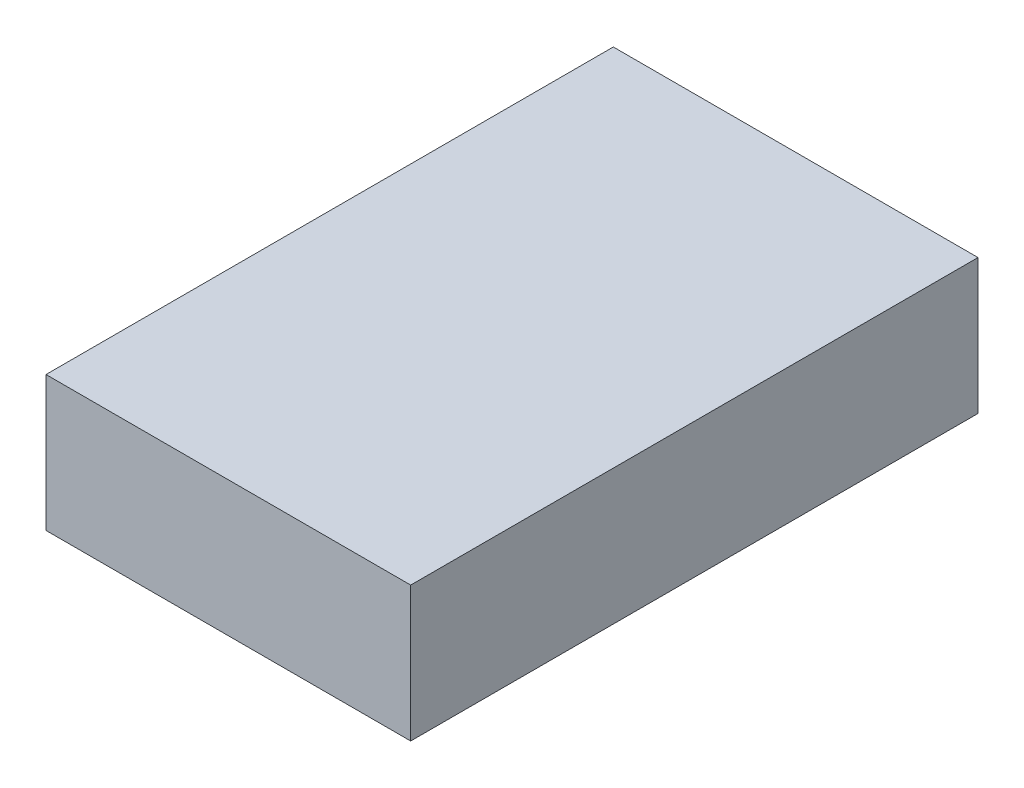
ISO-10303-21;
HEADER;
FILE_DESCRIPTION(('STEP AP214'),'2;1');
FILE_NAME('part.step','',(''),(''),'','','');
FILE_SCHEMA(('AUTOMOTIVE_DESIGN { 1 0 10303 214 1 1 1 1 }'));
ENDSEC;
DATA;
#1=APPLICATION_CONTEXT('core data for automotive mechanical design processes');
#2=APPLICATION_PROTOCOL_DEFINITION('international standard','automotive_design',2000,#1);
#3=PRODUCT_CONTEXT('',#1,'mechanical');
#4=PRODUCT('Part','Part','',(#3));
#5=PRODUCT_RELATED_PRODUCT_CATEGORY('part','',(#4));
#6=PRODUCT_DEFINITION_FORMATION('','',#4);
#7=PRODUCT_DEFINITION_CONTEXT('part definition',#1,'design');
#8=PRODUCT_DEFINITION('design','',#6,#7);
#9=PRODUCT_DEFINITION_SHAPE('','',#8);
#10=(LENGTH_UNIT() NAMED_UNIT(*) SI_UNIT(.MILLI.,.METRE.));
#11=(NAMED_UNIT(*) PLANE_ANGLE_UNIT() SI_UNIT($,.RADIAN.));
#12=(NAMED_UNIT(*) SI_UNIT($,.STERADIAN.) SOLID_ANGLE_UNIT());
#13=UNCERTAINTY_MEASURE_WITH_UNIT(LENGTH_MEASURE(1.E-05),#10,'distance_accuracy_value','');
#14=(GEOMETRIC_REPRESENTATION_CONTEXT(3) GLOBAL_UNCERTAINTY_ASSIGNED_CONTEXT((#13)) GLOBAL_UNIT_ASSIGNED_CONTEXT((#10,
#11,#12)) REPRESENTATION_CONTEXT('',''));
#15=CARTESIAN_POINT('',(0.,0.,0.));
#16=DIRECTION('',(0.,0.,1.));
#17=DIRECTION('',(1.,0.,0.));
#18=AXIS2_PLACEMENT_3D('',#15,#16,#17);
#19=CARTESIAN_POINT('',(67.5,-25.,210.));
#20=DIRECTION('',(-1.,0.,0.));
#21=DIRECTION('',(0.,0.,1.));
#22=AXIS2_PLACEMENT_3D('',#19,#20,#21);
#23=PLANE('',#22);
#24=DIRECTION('',(0.,1.,0.));
#25=VECTOR('',#24,1.);
#26=CARTESIAN_POINT('',(67.5,-25.,0.));
#27=LINE('',#26,#25);
#28=CARTESIAN_POINT('',(67.5,-25.,0.));
#29=VERTEX_POINT('',#28);
#30=CARTESIAN_POINT('',(67.5,25.,0.));
#31=VERTEX_POINT('',#30);
#32=EDGE_CURVE('E96',#29,#31,#27,.T.);
#33=ORIENTED_EDGE('',*,*,#32,.T.);
#34=DIRECTION('',(0.,0.,-1.));
#35=VECTOR('',#34,1.);
#36=CARTESIAN_POINT('',(67.5,25.,210.));
#37=LINE('',#36,#35);
#38=CARTESIAN_POINT('',(67.5,25.,210.));
#39=VERTEX_POINT('',#38);
#40=EDGE_CURVE('E11',#39,#31,#37,.T.);
#41=ORIENTED_EDGE('',*,*,#40,.F.);
#42=DIRECTION('',(0.,1.,0.));
#43=VECTOR('',#42,1.);
#44=CARTESIAN_POINT('',(67.5,-25.,210.));
#45=LINE('',#44,#43);
#46=CARTESIAN_POINT('',(67.5,-25.,210.));
#47=VERTEX_POINT('',#46);
#48=EDGE_CURVE('E84',#47,#39,#45,.T.);
#49=ORIENTED_EDGE('',*,*,#48,.F.);
#50=DIRECTION('',(0.,0.,-1.));
#51=VECTOR('',#50,1.);
#52=CARTESIAN_POINT('',(67.5,-25.,210.));
#53=LINE('',#52,#51);
#54=EDGE_CURVE('E92',#47,#29,#53,.T.);
#55=ORIENTED_EDGE('',*,*,#54,.T.);
#56=EDGE_LOOP('',(#33,#41,#49,#55));
#57=FACE_BOUND('',#56,.T.);
#58=ADVANCED_FACE('F33',(#57),#23,.F.);
#59=CARTESIAN_POINT('',(-67.5,25.,210.));
#60=DIRECTION('',(0.,-1.,0.));
#61=DIRECTION('',(0.,0.,-1.));
#62=AXIS2_PLACEMENT_3D('',#59,#60,#61);
#63=PLANE('',#62);
#64=DIRECTION('',(-1.,0.,0.));
#65=VECTOR('',#64,1.);
#66=CARTESIAN_POINT('',(-67.5,25.,0.));
#67=LINE('',#66,#65);
#68=CARTESIAN_POINT('',(-67.5,25.,0.));
#69=VERTEX_POINT('',#68);
#70=EDGE_CURVE('E88',#31,#69,#67,.T.);
#71=ORIENTED_EDGE('',*,*,#70,.T.);
#72=DIRECTION('',(0.,0.,-1.));
#73=VECTOR('',#72,1.);
#74=CARTESIAN_POINT('',(-67.5,25.,210.));
#75=LINE('',#74,#73);
#76=CARTESIAN_POINT('',(-67.5,25.,210.));
#77=VERTEX_POINT('',#76);
#78=EDGE_CURVE('E41',#77,#69,#75,.T.);
#79=ORIENTED_EDGE('',*,*,#78,.F.);
#80=DIRECTION('',(-1.,0.,0.));
#81=VECTOR('',#80,1.);
#82=CARTESIAN_POINT('',(-67.5,25.,210.));
#83=LINE('',#82,#81);
#84=EDGE_CURVE('E79',#39,#77,#83,.T.);
#85=ORIENTED_EDGE('',*,*,#84,.F.);
#86=ORIENTED_EDGE('',*,*,#40,.T.);
#87=EDGE_LOOP('',(#71,#79,#85,#86));
#88=FACE_BOUND('',#87,.T.);
#89=ADVANCED_FACE('F87',(#88),#63,.F.);
#90=CARTESIAN_POINT('',(-67.5,-25.,210.));
#91=DIRECTION('',(1.,0.,0.));
#92=DIRECTION('',(0.,0.,-1.));
#93=AXIS2_PLACEMENT_3D('',#90,#91,#92);
#94=PLANE('',#93);
#95=DIRECTION('',(0.,-1.,0.));
#96=VECTOR('',#95,1.);
#97=CARTESIAN_POINT('',(-67.5,-25.,0.));
#98=LINE('',#97,#96);
#99=CARTESIAN_POINT('',(-67.5,-25.,0.));
#100=VERTEX_POINT('',#99);
#101=EDGE_CURVE('E66',#69,#100,#98,.T.);
#102=ORIENTED_EDGE('',*,*,#101,.T.);
#103=DIRECTION('',(0.,0.,-1.));
#104=VECTOR('',#103,1.);
#105=CARTESIAN_POINT('',(-67.5,-25.,210.));
#106=LINE('',#105,#104);
#107=CARTESIAN_POINT('',(-67.5,-25.,210.));
#108=VERTEX_POINT('',#107);
#109=EDGE_CURVE('E89',#108,#100,#106,.T.);
#110=ORIENTED_EDGE('',*,*,#109,.F.);
#111=DIRECTION('',(0.,-1.,0.));
#112=VECTOR('',#111,1.);
#113=CARTESIAN_POINT('',(-67.5,-25.,210.));
#114=LINE('',#113,#112);
#115=EDGE_CURVE('E82',#77,#108,#114,.T.);
#116=ORIENTED_EDGE('',*,*,#115,.F.);
#117=ORIENTED_EDGE('',*,*,#78,.T.);
#118=EDGE_LOOP('',(#102,#110,#116,#117));
#119=FACE_BOUND('',#118,.T.);
#120=ADVANCED_FACE('F90',(#119),#94,.F.);
#121=CARTESIAN_POINT('',(-67.5,-25.,210.));
#122=DIRECTION('',(0.,1.,0.));
#123=DIRECTION('',(0.,0.,1.));
#124=AXIS2_PLACEMENT_3D('',#121,#122,#123);
#125=PLANE('',#124);
#126=DIRECTION('',(1.,0.,0.));
#127=VECTOR('',#126,1.);
#128=CARTESIAN_POINT('',(-67.5,-25.,0.));
#129=LINE('',#128,#127);
#130=EDGE_CURVE('E72',#100,#29,#129,.T.);
#131=ORIENTED_EDGE('',*,*,#130,.T.);
#132=ORIENTED_EDGE('',*,*,#54,.F.);
#133=DIRECTION('',(1.,0.,0.));
#134=VECTOR('',#133,1.);
#135=CARTESIAN_POINT('',(-67.5,-25.,210.));
#136=LINE('',#135,#134);
#137=EDGE_CURVE('E49',#108,#47,#136,.T.);
#138=ORIENTED_EDGE('',*,*,#137,.F.);
#139=ORIENTED_EDGE('',*,*,#109,.T.);
#140=EDGE_LOOP('',(#131,#132,#138,#139));
#141=FACE_BOUND('',#140,.T.);
#142=ADVANCED_FACE('F103',(#141),#125,.F.);
#143=CARTESIAN_POINT('',(0.,0.,210.));
#144=DIRECTION('',(0.,0.,-1.));
#145=DIRECTION('',(-1.,0.,0.));
#146=AXIS2_PLACEMENT_3D('',#143,#144,#145);
#147=PLANE('',#146);
#148=ORIENTED_EDGE('',*,*,#48,.T.);
#149=ORIENTED_EDGE('',*,*,#84,.T.);
#150=ORIENTED_EDGE('',*,*,#115,.T.);
#151=ORIENTED_EDGE('',*,*,#137,.T.);
#152=EDGE_LOOP('',(#148,#149,#150,#151));
#153=FACE_BOUND('',#152,.T.);
#154=ADVANCED_FACE('F80',(#153),#147,.F.);
#155=CARTESIAN_POINT('',(0.,0.,0.));
#156=DIRECTION('',(0.,0.,-1.));
#157=DIRECTION('',(-1.,0.,0.));
#158=AXIS2_PLACEMENT_3D('',#155,#156,#157);
#159=PLANE('',#158);
#160=ORIENTED_EDGE('',*,*,#32,.F.);
#161=ORIENTED_EDGE('',*,*,#130,.F.);
#162=ORIENTED_EDGE('',*,*,#101,.F.);
#163=ORIENTED_EDGE('',*,*,#70,.F.);
#164=EDGE_LOOP('',(#160,#161,#162,#163));
#165=FACE_BOUND('',#164,.T.);
#166=ADVANCED_FACE('F106',(#165),#159,.T.);
#167=CLOSED_SHELL('',(#58,#89,#120,#142,#154,#166));
#168=MANIFOLD_SOLID_BREP('B2',#167);
#169=ADVANCED_BREP_SHAPE_REPRESENTATION('',(#18,#168),#14);
#170=SHAPE_DEFINITION_REPRESENTATION(#9,#169);
ENDSEC;
END-ISO-10303-21;
